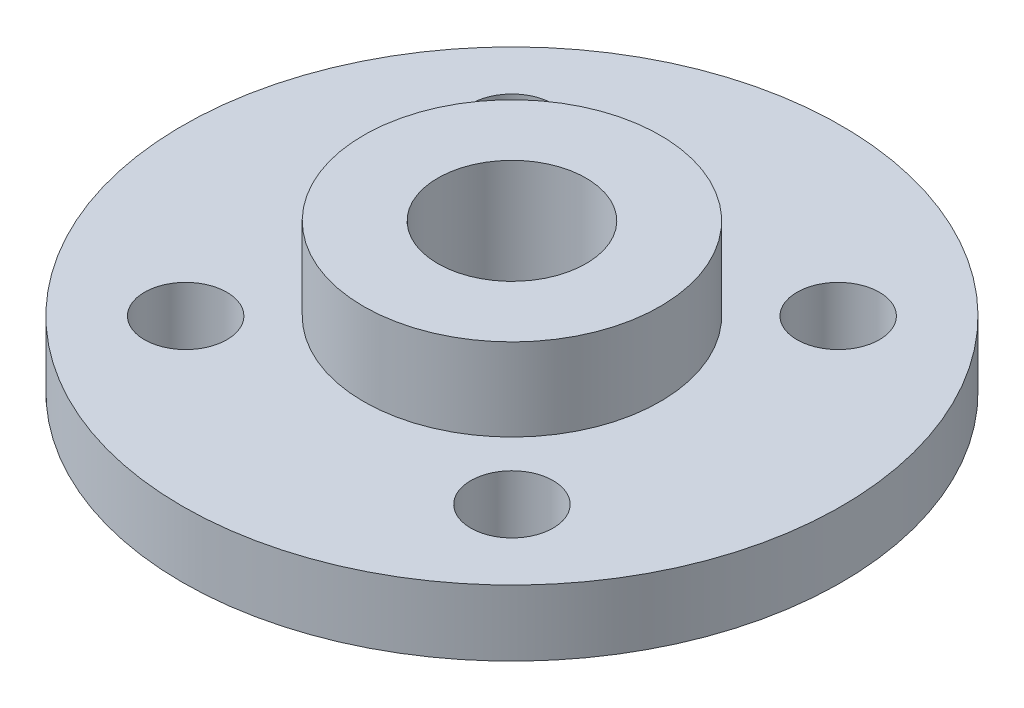
ISO-10303-21;
HEADER;
FILE_DESCRIPTION(('STEP AP214'),'2;1');
FILE_NAME('part.step','',(''),(''),'','','');
FILE_SCHEMA(('AUTOMOTIVE_DESIGN { 1 0 10303 214 1 1 1 1 }'));
ENDSEC;
DATA;
#1=APPLICATION_CONTEXT('core data for automotive mechanical design processes');
#2=APPLICATION_PROTOCOL_DEFINITION('international standard','automotive_design',2000,#1);
#3=PRODUCT_CONTEXT('',#1,'mechanical');
#4=PRODUCT('Part','Part','',(#3));
#5=PRODUCT_RELATED_PRODUCT_CATEGORY('part','',(#4));
#6=PRODUCT_DEFINITION_FORMATION('','',#4);
#7=PRODUCT_DEFINITION_CONTEXT('part definition',#1,'design');
#8=PRODUCT_DEFINITION('design','',#6,#7);
#9=PRODUCT_DEFINITION_SHAPE('','',#8);
#10=(LENGTH_UNIT() NAMED_UNIT(*) SI_UNIT(.MILLI.,.METRE.));
#11=(NAMED_UNIT(*) PLANE_ANGLE_UNIT() SI_UNIT($,.RADIAN.));
#12=(NAMED_UNIT(*) SI_UNIT($,.STERADIAN.) SOLID_ANGLE_UNIT());
#13=UNCERTAINTY_MEASURE_WITH_UNIT(LENGTH_MEASURE(1.E-05),#10,'distance_accuracy_value','');
#14=(GEOMETRIC_REPRESENTATION_CONTEXT(3) GLOBAL_UNCERTAINTY_ASSIGNED_CONTEXT((#13)) GLOBAL_UNIT_ASSIGNED_CONTEXT((#10,
#11,#12)) REPRESENTATION_CONTEXT('',''));
#15=CARTESIAN_POINT('',(0.,0.,0.));
#16=DIRECTION('',(0.,0.,1.));
#17=DIRECTION('',(1.,0.,0.));
#18=AXIS2_PLACEMENT_3D('',#15,#16,#17);
#19=CARTESIAN_POINT('',(0.,2.,0.));
#20=DIRECTION('',(0.,-1.,0.));
#21=DIRECTION('',(0.,0.,-1.));
#22=AXIS2_PLACEMENT_3D('',#19,#20,#21);
#23=CYLINDRICAL_SURFACE('',#22,1.5);
#24=CARTESIAN_POINT('',(0.,0.,0.));
#25=DIRECTION('',(0.,1.,0.));
#26=DIRECTION('',(0.,0.,1.));
#27=AXIS2_PLACEMENT_3D('',#24,#25,#26);
#28=CIRCLE('',#27,1.5);
#29=CARTESIAN_POINT('',(0.,0.,1.5));
#30=VERTEX_POINT('',#29);
#31=EDGE_CURVE('E68',#30,#30,#28,.T.);
#32=ORIENTED_EDGE('',*,*,#31,.F.);
#33=EDGE_LOOP('',(#32));
#34=FACE_BOUND('',#33,.T.);
#35=CARTESIAN_POINT('',(0.,0.900000000000001,0.));
#36=DIRECTION('',(0.,1.,0.));
#37=DIRECTION('',(0.,0.,1.));
#38=AXIS2_PLACEMENT_3D('',#35,#36,#37);
#39=CIRCLE('',#38,1.5);
#40=CARTESIAN_POINT('',(0.,0.900000000000001,1.5));
#41=VERTEX_POINT('',#40);
#42=EDGE_CURVE('E36',#41,#41,#39,.T.);
#43=ORIENTED_EDGE('',*,*,#42,.T.);
#44=EDGE_LOOP('',(#43));
#45=FACE_BOUND('',#44,.T.);
#46=ADVANCED_FACE('F32',(#34,#45),#23,.F.);
#47=CARTESIAN_POINT('',(0.,2.,0.));
#48=DIRECTION('',(0.,1.,0.));
#49=DIRECTION('',(0.,0.,1.));
#50=AXIS2_PLACEMENT_3D('',#47,#48,#49);
#51=PLANE('',#50);
#52=CARTESIAN_POINT('',(4.94974746830583,2.,4.94974746830583));
#53=DIRECTION('',(0.,1.,0.));
#54=DIRECTION('',(0.,0.,1.));
#55=AXIS2_PLACEMENT_3D('',#52,#53,#54);
#56=CIRCLE('',#55,1.25);
#57=CARTESIAN_POINT('',(4.94974746830583,2.,6.19974746830583));
#58=VERTEX_POINT('',#57);
#59=EDGE_CURVE('E56',#58,#58,#56,.T.);
#60=ORIENTED_EDGE('',*,*,#59,.F.);
#61=EDGE_LOOP('',(#60));
#62=FACE_BOUND('',#61,.T.);
#63=CARTESIAN_POINT('',(-4.94974746830583,2.,-4.94974746830583));
#64=DIRECTION('',(0.,1.,0.));
#65=DIRECTION('',(0.,0.,1.));
#66=AXIS2_PLACEMENT_3D('',#63,#64,#65);
#67=CIRCLE('',#66,1.25);
#68=CARTESIAN_POINT('',(-4.94974746830583,2.,-3.69974746830583));
#69=VERTEX_POINT('',#68);
#70=EDGE_CURVE('E45',#69,#69,#67,.T.);
#71=ORIENTED_EDGE('',*,*,#70,.F.);
#72=EDGE_LOOP('',(#71));
#73=FACE_BOUND('',#72,.T.);
#74=CARTESIAN_POINT('',(0.,2.,0.));
#75=DIRECTION('',(0.,1.,0.));
#76=DIRECTION('',(0.,0.,1.));
#77=AXIS2_PLACEMENT_3D('',#74,#75,#76);
#78=CIRCLE('',#77,10.);
#79=CARTESIAN_POINT('',(0.,2.,10.));
#80=VERTEX_POINT('',#79);
#81=EDGE_CURVE('E10',#80,#80,#78,.T.);
#82=ORIENTED_EDGE('',*,*,#81,.T.);
#83=EDGE_LOOP('',(#82));
#84=FACE_BOUND('',#83,.T.);
#85=CARTESIAN_POINT('',(4.94974746830583,2.,-4.94974746830583));
#86=DIRECTION('',(0.,1.,0.));
#87=DIRECTION('',(0.,0.,1.));
#88=AXIS2_PLACEMENT_3D('',#85,#86,#87);
#89=CIRCLE('',#88,1.25);
#90=CARTESIAN_POINT('',(4.94974746830583,2.,-3.69974746830583));
#91=VERTEX_POINT('',#90);
#92=EDGE_CURVE('E50',#91,#91,#89,.T.);
#93=ORIENTED_EDGE('',*,*,#92,.F.);
#94=EDGE_LOOP('',(#93));
#95=FACE_BOUND('',#94,.T.);
#96=CARTESIAN_POINT('',(-4.94974746830583,2.,4.94974746830583));
#97=DIRECTION('',(0.,1.,0.));
#98=DIRECTION('',(0.,0.,1.));
#99=AXIS2_PLACEMENT_3D('',#96,#97,#98);
#100=CIRCLE('',#99,1.25);
#101=CARTESIAN_POINT('',(-4.94974746830583,2.,6.19974746830583));
#102=VERTEX_POINT('',#101);
#103=EDGE_CURVE('E62',#102,#102,#100,.T.);
#104=ORIENTED_EDGE('',*,*,#103,.F.);
#105=EDGE_LOOP('',(#104));
#106=FACE_BOUND('',#105,.T.);
#107=CARTESIAN_POINT('',(0.,2.,0.));
#108=DIRECTION('',(0.,1.,0.));
#109=DIRECTION('',(0.,0.,1.));
#110=AXIS2_PLACEMENT_3D('',#107,#108,#109);
#111=CIRCLE('',#110,4.5);
#112=CARTESIAN_POINT('',(0.,2.,4.5));
#113=VERTEX_POINT('',#112);
#114=EDGE_CURVE('E74',#113,#113,#111,.T.);
#115=ORIENTED_EDGE('',*,*,#114,.F.);
#116=EDGE_LOOP('',(#115));
#117=FACE_BOUND('',#116,.T.);
#118=ADVANCED_FACE('F101',(#62,#73,#84,#95,#106,#117),#51,.T.);
#119=CARTESIAN_POINT('',(0.,0.,0.));
#120=DIRECTION('',(0.,1.,0.));
#121=DIRECTION('',(0.,0.,1.));
#122=AXIS2_PLACEMENT_3D('',#119,#120,#121);
#123=PLANE('',#122);
#124=CARTESIAN_POINT('',(0.,0.,0.));
#125=DIRECTION('',(0.,1.,0.));
#126=DIRECTION('',(0.,0.,1.));
#127=AXIS2_PLACEMENT_3D('',#124,#125,#126);
#128=CIRCLE('',#127,10.);
#129=CARTESIAN_POINT('',(0.,0.,10.));
#130=VERTEX_POINT('',#129);
#131=EDGE_CURVE('E40',#130,#130,#128,.T.);
#132=ORIENTED_EDGE('',*,*,#131,.F.);
#133=EDGE_LOOP('',(#132));
#134=FACE_BOUND('',#133,.T.);
#135=CARTESIAN_POINT('',(-4.94974746830583,0.,-4.94974746830583));
#136=DIRECTION('',(0.,1.,0.));
#137=DIRECTION('',(0.,0.,1.));
#138=AXIS2_PLACEMENT_3D('',#135,#136,#137);
#139=CIRCLE('',#138,1.25);
#140=CARTESIAN_POINT('',(-4.94974746830583,0.,-3.69974746830583));
#141=VERTEX_POINT('',#140);
#142=EDGE_CURVE('E47',#141,#141,#139,.T.);
#143=ORIENTED_EDGE('',*,*,#142,.T.);
#144=EDGE_LOOP('',(#143));
#145=FACE_BOUND('',#144,.T.);
#146=CARTESIAN_POINT('',(4.94974746830583,0.,-4.94974746830583));
#147=DIRECTION('',(0.,1.,0.));
#148=DIRECTION('',(0.,0.,1.));
#149=AXIS2_PLACEMENT_3D('',#146,#147,#148);
#150=CIRCLE('',#149,1.25);
#151=CARTESIAN_POINT('',(4.94974746830583,0.,-3.69974746830583));
#152=VERTEX_POINT('',#151);
#153=EDGE_CURVE('E53',#152,#152,#150,.T.);
#154=ORIENTED_EDGE('',*,*,#153,.T.);
#155=EDGE_LOOP('',(#154));
#156=FACE_BOUND('',#155,.T.);
#157=CARTESIAN_POINT('',(4.94974746830583,0.,4.94974746830583));
#158=DIRECTION('',(0.,1.,0.));
#159=DIRECTION('',(0.,0.,1.));
#160=AXIS2_PLACEMENT_3D('',#157,#158,#159);
#161=CIRCLE('',#160,1.25);
#162=CARTESIAN_POINT('',(4.94974746830583,0.,6.19974746830583));
#163=VERTEX_POINT('',#162);
#164=EDGE_CURVE('E59',#163,#163,#161,.T.);
#165=ORIENTED_EDGE('',*,*,#164,.T.);
#166=EDGE_LOOP('',(#165));
#167=FACE_BOUND('',#166,.T.);
#168=CARTESIAN_POINT('',(-4.94974746830583,0.,4.94974746830583));
#169=DIRECTION('',(0.,1.,0.));
#170=DIRECTION('',(0.,0.,1.));
#171=AXIS2_PLACEMENT_3D('',#168,#169,#170);
#172=CIRCLE('',#171,1.25);
#173=CARTESIAN_POINT('',(-4.94974746830583,0.,6.19974746830583));
#174=VERTEX_POINT('',#173);
#175=EDGE_CURVE('E65',#174,#174,#172,.T.);
#176=ORIENTED_EDGE('',*,*,#175,.T.);
#177=EDGE_LOOP('',(#176));
#178=FACE_BOUND('',#177,.T.);
#179=ORIENTED_EDGE('',*,*,#31,.T.);
#180=EDGE_LOOP('',(#179));
#181=FACE_BOUND('',#180,.T.);
#182=ADVANCED_FACE('F107',(#134,#145,#156,#167,#178,#181),#123,.F.);
#183=CARTESIAN_POINT('',(0.,2.,0.));
#184=DIRECTION('',(0.,-1.,0.));
#185=DIRECTION('',(0.,0.,-1.));
#186=AXIS2_PLACEMENT_3D('',#183,#184,#185);
#187=CYLINDRICAL_SURFACE('',#186,10.);
#188=ORIENTED_EDGE('',*,*,#81,.F.);
#189=EDGE_LOOP('',(#188));
#190=FACE_BOUND('',#189,.T.);
#191=ORIENTED_EDGE('',*,*,#131,.T.);
#192=EDGE_LOOP('',(#191));
#193=FACE_BOUND('',#192,.T.);
#194=ADVANCED_FACE('F34',(#190,#193),#187,.T.);
#195=CARTESIAN_POINT('',(-4.94974746830583,2.,-4.94974746830583));
#196=DIRECTION('',(0.,-1.,0.));
#197=DIRECTION('',(0.,0.,-1.));
#198=AXIS2_PLACEMENT_3D('',#195,#196,#197);
#199=CYLINDRICAL_SURFACE('',#198,1.25);
#200=ORIENTED_EDGE('',*,*,#70,.T.);
#201=EDGE_LOOP('',(#200));
#202=FACE_BOUND('',#201,.T.);
#203=ORIENTED_EDGE('',*,*,#142,.F.);
#204=EDGE_LOOP('',(#203));
#205=FACE_BOUND('',#204,.T.);
#206=ADVANCED_FACE('F126',(#202,#205),#199,.F.);
#207=CARTESIAN_POINT('',(4.94974746830583,2.,-4.94974746830583));
#208=DIRECTION('',(0.,-1.,0.));
#209=DIRECTION('',(0.,0.,-1.));
#210=AXIS2_PLACEMENT_3D('',#207,#208,#209);
#211=CYLINDRICAL_SURFACE('',#210,1.25);
#212=ORIENTED_EDGE('',*,*,#92,.T.);
#213=EDGE_LOOP('',(#212));
#214=FACE_BOUND('',#213,.T.);
#215=ORIENTED_EDGE('',*,*,#153,.F.);
#216=EDGE_LOOP('',(#215));
#217=FACE_BOUND('',#216,.T.);
#218=ADVANCED_FACE('F122',(#214,#217),#211,.F.);
#219=CARTESIAN_POINT('',(4.94974746830583,2.,4.94974746830583));
#220=DIRECTION('',(0.,-1.,0.));
#221=DIRECTION('',(0.,0.,-1.));
#222=AXIS2_PLACEMENT_3D('',#219,#220,#221);
#223=CYLINDRICAL_SURFACE('',#222,1.25);
#224=ORIENTED_EDGE('',*,*,#59,.T.);
#225=EDGE_LOOP('',(#224));
#226=FACE_BOUND('',#225,.T.);
#227=ORIENTED_EDGE('',*,*,#164,.F.);
#228=EDGE_LOOP('',(#227));
#229=FACE_BOUND('',#228,.T.);
#230=ADVANCED_FACE('F118',(#226,#229),#223,.F.);
#231=CARTESIAN_POINT('',(-4.94974746830583,2.,4.94974746830583));
#232=DIRECTION('',(0.,-1.,0.));
#233=DIRECTION('',(0.,0.,-1.));
#234=AXIS2_PLACEMENT_3D('',#231,#232,#233);
#235=CYLINDRICAL_SURFACE('',#234,1.25);
#236=ORIENTED_EDGE('',*,*,#103,.T.);
#237=EDGE_LOOP('',(#236));
#238=FACE_BOUND('',#237,.T.);
#239=ORIENTED_EDGE('',*,*,#175,.F.);
#240=EDGE_LOOP('',(#239));
#241=FACE_BOUND('',#240,.T.);
#242=ADVANCED_FACE('F114',(#238,#241),#235,.F.);
#243=CARTESIAN_POINT('',(0.,4.5,0.));
#244=DIRECTION('',(0.,1.,0.));
#245=DIRECTION('',(0.,0.,1.));
#246=AXIS2_PLACEMENT_3D('',#243,#244,#245);
#247=PLANE('',#246);
#248=CARTESIAN_POINT('',(0.,4.5,0.));
#249=DIRECTION('',(0.,1.,0.));
#250=DIRECTION('',(0.,0.,1.));
#251=AXIS2_PLACEMENT_3D('',#248,#249,#250);
#252=CIRCLE('',#251,2.25);
#253=CARTESIAN_POINT('',(0.,4.5,2.25));
#254=VERTEX_POINT('',#253);
#255=EDGE_CURVE('E79',#254,#254,#252,.T.);
#256=ORIENTED_EDGE('',*,*,#255,.F.);
#257=EDGE_LOOP('',(#256));
#258=FACE_BOUND('',#257,.T.);
#259=CARTESIAN_POINT('',(0.,4.5,0.));
#260=DIRECTION('',(0.,1.,0.));
#261=DIRECTION('',(0.,0.,1.));
#262=AXIS2_PLACEMENT_3D('',#259,#260,#261);
#263=CIRCLE('',#262,4.5);
#264=CARTESIAN_POINT('',(0.,4.5,4.5));
#265=VERTEX_POINT('',#264);
#266=EDGE_CURVE('E73',#265,#265,#263,.T.);
#267=ORIENTED_EDGE('',*,*,#266,.T.);
#268=EDGE_LOOP('',(#267));
#269=FACE_BOUND('',#268,.T.);
#270=ADVANCED_FACE('F117',(#258,#269),#247,.T.);
#271=CARTESIAN_POINT('',(0.,4.5,0.));
#272=DIRECTION('',(0.,-1.,0.));
#273=DIRECTION('',(0.,0.,-1.));
#274=AXIS2_PLACEMENT_3D('',#271,#272,#273);
#275=CYLINDRICAL_SURFACE('',#274,4.5);
#276=ORIENTED_EDGE('',*,*,#266,.F.);
#277=EDGE_LOOP('',(#276));
#278=FACE_BOUND('',#277,.T.);
#279=ORIENTED_EDGE('',*,*,#114,.T.);
#280=EDGE_LOOP('',(#279));
#281=FACE_BOUND('',#280,.T.);
#282=ADVANCED_FACE('F97',(#278,#281),#275,.T.);
#283=CARTESIAN_POINT('',(0.,0.900000000000001,0.));
#284=DIRECTION('',(0.,1.,0.));
#285=DIRECTION('',(0.,0.,1.));
#286=AXIS2_PLACEMENT_3D('',#283,#284,#285);
#287=CYLINDRICAL_SURFACE('',#286,2.25);
#288=CARTESIAN_POINT('',(0.,0.900000000000001,0.));
#289=DIRECTION('',(0.,1.,0.));
#290=DIRECTION('',(0.,0.,1.));
#291=AXIS2_PLACEMENT_3D('',#288,#289,#290);
#292=CIRCLE('',#291,2.25);
#293=CARTESIAN_POINT('',(0.,0.900000000000001,2.25));
#294=VERTEX_POINT('',#293);
#295=EDGE_CURVE('E82',#294,#294,#292,.T.);
#296=ORIENTED_EDGE('',*,*,#295,.F.);
#297=EDGE_LOOP('',(#296));
#298=FACE_BOUND('',#297,.T.);
#299=ORIENTED_EDGE('',*,*,#255,.T.);
#300=EDGE_LOOP('',(#299));
#301=FACE_BOUND('',#300,.T.);
#302=ADVANCED_FACE('F92',(#298,#301),#287,.F.);
#303=CARTESIAN_POINT('',(0.,0.900000000000001,0.));
#304=DIRECTION('',(0.,1.,0.));
#305=DIRECTION('',(0.,0.,1.));
#306=AXIS2_PLACEMENT_3D('',#303,#304,#305);
#307=PLANE('',#306);
#308=ORIENTED_EDGE('',*,*,#42,.F.);
#309=EDGE_LOOP('',(#308));
#310=FACE_BOUND('',#309,.T.);
#311=ORIENTED_EDGE('',*,*,#295,.T.);
#312=EDGE_LOOP('',(#311));
#313=FACE_BOUND('',#312,.T.);
#314=ADVANCED_FACE('F90',(#310,#313),#307,.T.);
#315=CLOSED_SHELL('',(#46,#118,#182,#194,#206,#218,#230,#242,#270,#282,#302,#314));
#316=MANIFOLD_SOLID_BREP('B2',#315);
#317=ADVANCED_BREP_SHAPE_REPRESENTATION('',(#18,#316),#14);
#318=SHAPE_DEFINITION_REPRESENTATION(#9,#317);
ENDSEC;
END-ISO-10303-21;
